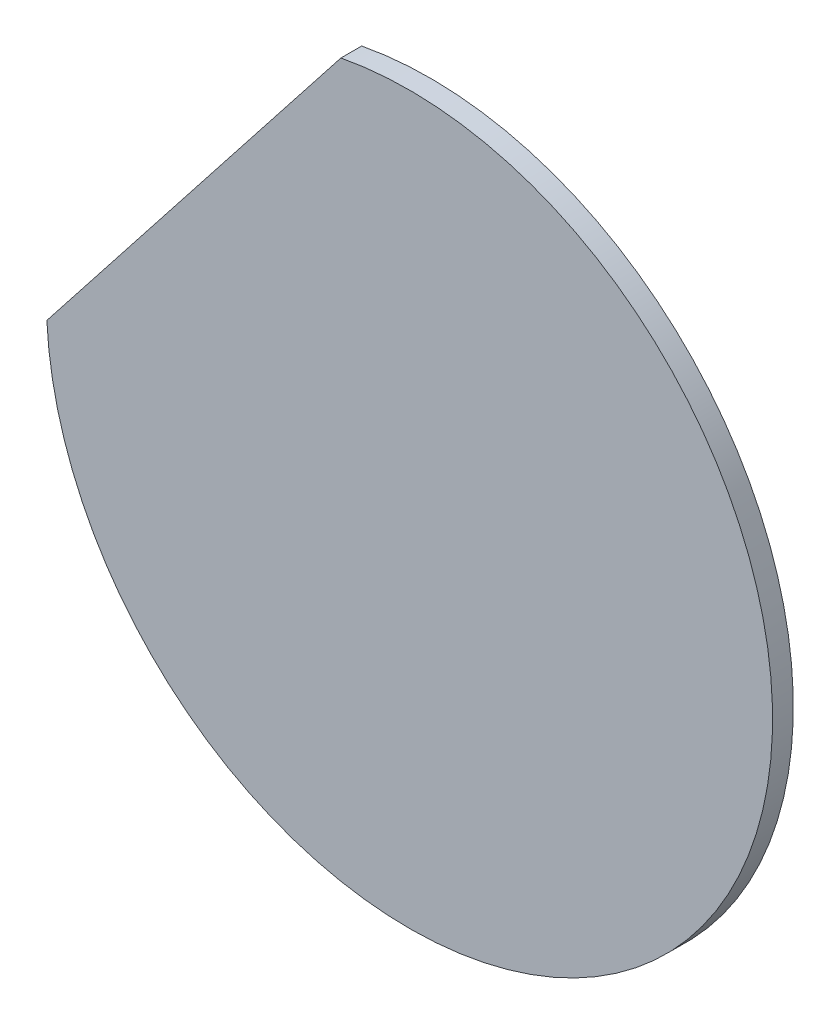
ISO-10303-21;
HEADER;
FILE_DESCRIPTION(('STEP AP214'),'2;1');
FILE_NAME('part.step','',(''),(''),'','','');
FILE_SCHEMA(('AUTOMOTIVE_DESIGN { 1 0 10303 214 1 1 1 1 }'));
ENDSEC;
DATA;
#1=APPLICATION_CONTEXT('core data for automotive mechanical design processes');
#2=APPLICATION_PROTOCOL_DEFINITION('international standard','automotive_design',2000,#1);
#3=PRODUCT_CONTEXT('',#1,'mechanical');
#4=PRODUCT('Part','Part','',(#3));
#5=PRODUCT_RELATED_PRODUCT_CATEGORY('part','',(#4));
#6=PRODUCT_DEFINITION_FORMATION('','',#4);
#7=PRODUCT_DEFINITION_CONTEXT('part definition',#1,'design');
#8=PRODUCT_DEFINITION('design','',#6,#7);
#9=PRODUCT_DEFINITION_SHAPE('','',#8);
#10=(LENGTH_UNIT() NAMED_UNIT(*) SI_UNIT(.MILLI.,.METRE.));
#11=(NAMED_UNIT(*) PLANE_ANGLE_UNIT() SI_UNIT($,.RADIAN.));
#12=(NAMED_UNIT(*) SI_UNIT($,.STERADIAN.) SOLID_ANGLE_UNIT());
#13=UNCERTAINTY_MEASURE_WITH_UNIT(LENGTH_MEASURE(1.E-05),#10,'distance_accuracy_value','');
#14=(GEOMETRIC_REPRESENTATION_CONTEXT(3) GLOBAL_UNCERTAINTY_ASSIGNED_CONTEXT((#13)) GLOBAL_UNIT_ASSIGNED_CONTEXT((#10,
#11,#12)) REPRESENTATION_CONTEXT('',''));
#15=CARTESIAN_POINT('',(0.,0.,0.));
#16=DIRECTION('',(0.,0.,1.));
#17=DIRECTION('',(1.,0.,0.));
#18=AXIS2_PLACEMENT_3D('',#15,#16,#17);
#19=CARTESIAN_POINT('',(-103.925142105047,81.6487184985217,10.));
#20=DIRECTION('',(0.786343150995705,-0.617789971496905,0.));
#21=DIRECTION('',(0.617789971496905,0.786343150995704,0.));
#22=AXIS2_PLACEMENT_3D('',#19,#20,#21);
#23=PLANE('',#22);
#24=DIRECTION('',(-0.617789971496905,-0.786343150995705,0.));
#25=VECTOR('',#24,1.);
#26=CARTESIAN_POINT('',(-103.925142105047,81.6487184985217,0.));
#27=LINE('',#26,#25);
#28=CARTESIAN_POINT('',(-33.059349831448,171.849001709995,0.));
#29=VERTEX_POINT('',#28);
#30=CARTESIAN_POINT('',(-174.790934378646,-8.55156471295178,0.));
#31=VERTEX_POINT('',#30);
#32=EDGE_CURVE('E64',#29,#31,#27,.T.);
#33=ORIENTED_EDGE('',*,*,#32,.T.);
#34=DIRECTION('',(0.,0.,-1.));
#35=VECTOR('',#34,1.);
#36=CARTESIAN_POINT('',(-174.790934378646,-8.55156471295178,10.));
#37=LINE('',#36,#35);
#38=CARTESIAN_POINT('',(-174.790934378646,-8.55156471295178,10.));
#39=VERTEX_POINT('',#38);
#40=EDGE_CURVE('E11',#39,#31,#37,.T.);
#41=ORIENTED_EDGE('',*,*,#40,.F.);
#42=DIRECTION('',(-0.617789971496905,-0.786343150995705,0.));
#43=VECTOR('',#42,1.);
#44=CARTESIAN_POINT('',(-103.925142105047,81.6487184985217,10.));
#45=LINE('',#44,#43);
#46=CARTESIAN_POINT('',(-33.059349831448,171.849001709995,10.));
#47=VERTEX_POINT('',#46);
#48=EDGE_CURVE('E63',#47,#39,#45,.T.);
#49=ORIENTED_EDGE('',*,*,#48,.F.);
#50=DIRECTION('',(0.,0.,-1.));
#51=VECTOR('',#50,1.);
#52=CARTESIAN_POINT('',(-33.059349831448,171.849001709995,10.));
#53=LINE('',#52,#51);
#54=EDGE_CURVE('E41',#47,#29,#53,.T.);
#55=ORIENTED_EDGE('',*,*,#54,.T.);
#56=EDGE_LOOP('',(#33,#41,#49,#55));
#57=FACE_BOUND('',#56,.T.);
#58=ADVANCED_FACE('F33',(#57),#23,.F.);
#59=CARTESIAN_POINT('',(0.,0.,10.));
#60=DIRECTION('',(0.,0.,-1.));
#61=DIRECTION('',(-1.,0.,0.));
#62=AXIS2_PLACEMENT_3D('',#59,#60,#61);
#63=CYLINDRICAL_SURFACE('',#62,175.);
#64=CARTESIAN_POINT('',(0.,0.,0.));
#65=DIRECTION('',(0.,0.,1.));
#66=DIRECTION('',(1.,0.,0.));
#67=AXIS2_PLACEMENT_3D('',#64,#65,#66);
#68=CIRCLE('',#67,175.);
#69=EDGE_CURVE('E56',#31,#29,#68,.T.);
#70=ORIENTED_EDGE('',*,*,#69,.T.);
#71=ORIENTED_EDGE('',*,*,#54,.F.);
#72=CARTESIAN_POINT('',(0.,0.,10.));
#73=DIRECTION('',(0.,0.,1.));
#74=DIRECTION('',(1.,0.,0.));
#75=AXIS2_PLACEMENT_3D('',#72,#73,#74);
#76=CIRCLE('',#75,175.);
#77=EDGE_CURVE('E48',#39,#47,#76,.T.);
#78=ORIENTED_EDGE('',*,*,#77,.F.);
#79=ORIENTED_EDGE('',*,*,#40,.T.);
#80=EDGE_LOOP('',(#70,#71,#78,#79));
#81=FACE_BOUND('',#80,.T.);
#82=ADVANCED_FACE('F59',(#81),#63,.T.);
#83=CARTESIAN_POINT('',(0.,0.,10.));
#84=DIRECTION('',(0.,0.,1.));
#85=DIRECTION('',(1.,0.,0.));
#86=AXIS2_PLACEMENT_3D('',#83,#84,#85);
#87=PLANE('',#86);
#88=ORIENTED_EDGE('',*,*,#48,.T.);
#89=ORIENTED_EDGE('',*,*,#77,.T.);
#90=EDGE_LOOP('',(#88,#89));
#91=FACE_BOUND('',#90,.T.);
#92=ADVANCED_FACE('F71',(#91),#87,.T.);
#93=CARTESIAN_POINT('',(0.,0.,0.));
#94=DIRECTION('',(0.,0.,1.));
#95=DIRECTION('',(1.,0.,0.));
#96=AXIS2_PLACEMENT_3D('',#93,#94,#95);
#97=PLANE('',#96);
#98=ORIENTED_EDGE('',*,*,#32,.F.);
#99=ORIENTED_EDGE('',*,*,#69,.F.);
#100=EDGE_LOOP('',(#98,#99));
#101=FACE_BOUND('',#100,.T.);
#102=ADVANCED_FACE('F67',(#101),#97,.F.);
#103=CLOSED_SHELL('',(#58,#82,#92,#102));
#104=MANIFOLD_SOLID_BREP('B2',#103);
#105=ADVANCED_BREP_SHAPE_REPRESENTATION('',(#18,#104),#14);
#106=SHAPE_DEFINITION_REPRESENTATION(#9,#105);
ENDSEC;
END-ISO-10303-21;
